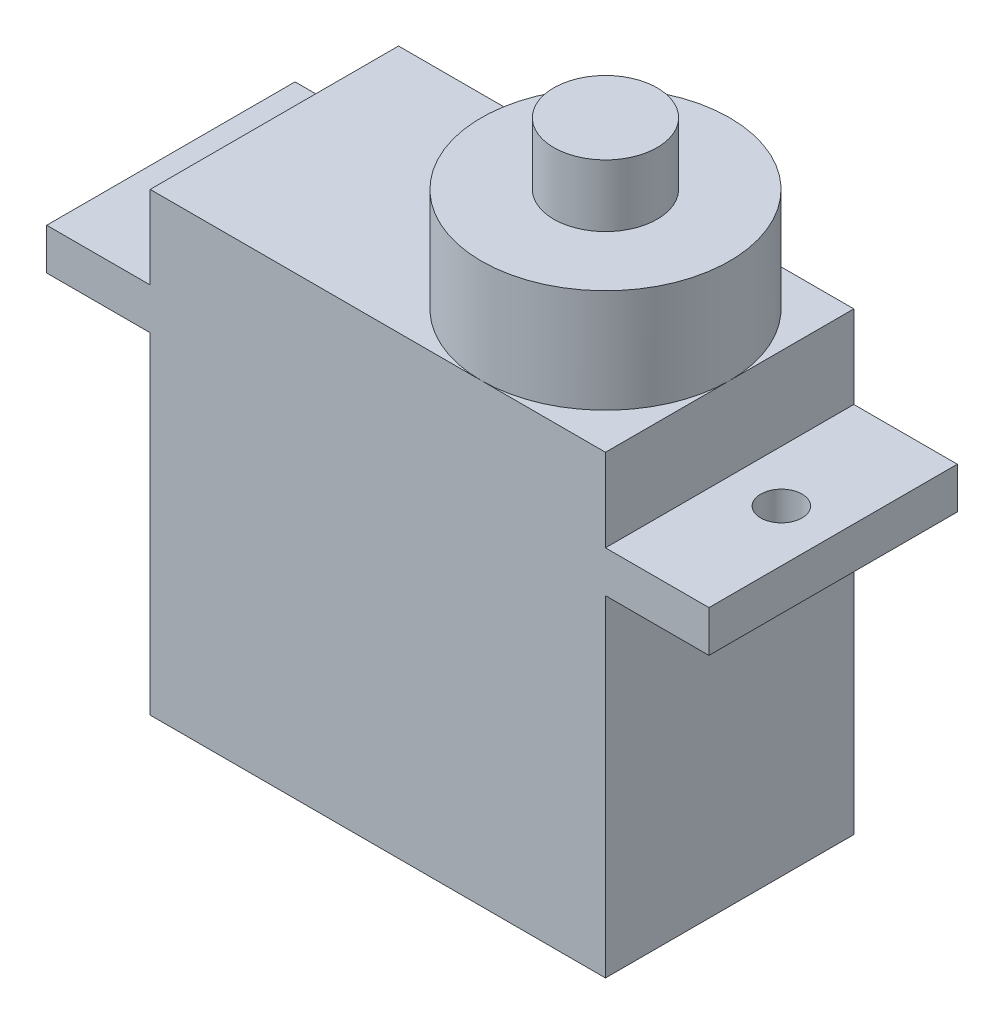
ISO-10303-21;
HEADER;
FILE_DESCRIPTION(('STEP AP214'),'2;1');
FILE_NAME('part.step','',(''),(''),'','','');
FILE_SCHEMA(('AUTOMOTIVE_DESIGN { 1 0 10303 214 1 1 1 1 }'));
ENDSEC;
DATA;
#1=APPLICATION_CONTEXT('core data for automotive mechanical design processes');
#2=APPLICATION_PROTOCOL_DEFINITION('international standard','automotive_design',2000,#1);
#3=PRODUCT_CONTEXT('',#1,'mechanical');
#4=PRODUCT('Part','Part','',(#3));
#5=PRODUCT_RELATED_PRODUCT_CATEGORY('part','',(#4));
#6=PRODUCT_DEFINITION_FORMATION('','',#4);
#7=PRODUCT_DEFINITION_CONTEXT('part definition',#1,'design');
#8=PRODUCT_DEFINITION('design','',#6,#7);
#9=PRODUCT_DEFINITION_SHAPE('','',#8);
#10=(LENGTH_UNIT() NAMED_UNIT(*) SI_UNIT(.MILLI.,.METRE.));
#11=(NAMED_UNIT(*) PLANE_ANGLE_UNIT() SI_UNIT($,.RADIAN.));
#12=(NAMED_UNIT(*) SI_UNIT($,.STERADIAN.) SOLID_ANGLE_UNIT());
#13=UNCERTAINTY_MEASURE_WITH_UNIT(LENGTH_MEASURE(1.E-05),#10,'distance_accuracy_value','');
#14=(GEOMETRIC_REPRESENTATION_CONTEXT(3) GLOBAL_UNCERTAINTY_ASSIGNED_CONTEXT((#13)) GLOBAL_UNIT_ASSIGNED_CONTEXT((#10,
#11,#12)) REPRESENTATION_CONTEXT('',''));
#15=CARTESIAN_POINT('',(0.,0.,0.));
#16=DIRECTION('',(0.,0.,1.));
#17=DIRECTION('',(1.,0.,0.));
#18=AXIS2_PLACEMENT_3D('',#15,#16,#17);
#19=CARTESIAN_POINT('',(16.,27.,-6.));
#20=DIRECTION('',(0.,1.,0.));
#21=DIRECTION('',(0.,0.,1.));
#22=AXIS2_PLACEMENT_3D('',#19,#20,#21);
#23=PLANE('',#22);
#24=CARTESIAN_POINT('',(16.,27.,-6.));
#25=DIRECTION('',(0.,1.,0.));
#26=DIRECTION('',(0.,0.,1.));
#27=AXIS2_PLACEMENT_3D('',#24,#25,#26);
#28=CIRCLE('',#27,6.);
#29=CARTESIAN_POINT('',(16.,27.,0.));
#30=VERTEX_POINT('',#29);
#31=EDGE_CURVE('E156',#30,#30,#28,.T.);
#32=ORIENTED_EDGE('',*,*,#31,.T.);
#33=EDGE_LOOP('',(#32));
#34=FACE_BOUND('',#33,.T.);
#35=CARTESIAN_POINT('',(16.,27.,-6.));
#36=DIRECTION('',(0.,1.,0.));
#37=DIRECTION('',(0.,0.,1.));
#38=AXIS2_PLACEMENT_3D('',#35,#36,#37);
#39=CIRCLE('',#38,2.5);
#40=CARTESIAN_POINT('',(16.,27.,-3.5));
#41=VERTEX_POINT('',#40);
#42=EDGE_CURVE('E457',#41,#41,#39,.T.);
#43=ORIENTED_EDGE('',*,*,#42,.F.);
#44=EDGE_LOOP('',(#43));
#45=FACE_BOUND('',#44,.T.);
#46=ADVANCED_FACE('F36',(#34,#45),#23,.T.);
#47=CARTESIAN_POINT('',(0.,22.,-12.));
#48=DIRECTION('',(0.,-1.,0.));
#49=DIRECTION('',(0.,0.,-1.));
#50=AXIS2_PLACEMENT_3D('',#47,#48,#49);
#51=PLANE('',#50);
#52=CARTESIAN_POINT('',(16.,22.,-6.));
#53=DIRECTION('',(0.,1.,0.));
#54=DIRECTION('',(0.,0.,1.));
#55=AXIS2_PLACEMENT_3D('',#52,#53,#54);
#56=CIRCLE('',#55,6.);
#57=CARTESIAN_POINT('',(16.,22.,0.));
#58=VERTEX_POINT('',#57);
#59=CARTESIAN_POINT('',(22.,22.,-6.));
#60=VERTEX_POINT('',#59);
#61=EDGE_CURVE('E47',#58,#60,#56,.T.);
#62=ORIENTED_EDGE('',*,*,#61,.F.);
#63=DIRECTION('',(1.,0.,0.));
#64=VECTOR('',#63,1.);
#65=CARTESIAN_POINT('',(0.,22.,0.));
#66=LINE('',#65,#64);
#67=CARTESIAN_POINT('',(22.,22.,0.));
#68=VERTEX_POINT('',#67);
#69=EDGE_CURVE('E142',#58,#68,#66,.T.);
#70=ORIENTED_EDGE('',*,*,#69,.T.);
#71=DIRECTION('',(0.,0.,-1.));
#72=VECTOR('',#71,1.);
#73=CARTESIAN_POINT('',(22.,22.,0.));
#74=LINE('',#73,#72);
#75=EDGE_CURVE('E154',#68,#60,#74,.T.);
#76=ORIENTED_EDGE('',*,*,#75,.T.);
#77=EDGE_LOOP('',(#62,#70,#76));
#78=FACE_BOUND('',#77,.T.);
#79=ADVANCED_FACE('F153',(#78),#51,.F.);
#80=CARTESIAN_POINT('',(16.,22.,-12.));
#81=VERTEX_POINT('',#80);
#82=EDGE_CURVE('E11',#60,#81,#56,.T.);
#83=ORIENTED_EDGE('',*,*,#82,.F.);
#84=CARTESIAN_POINT('',(22.,22.,-12.));
#85=VERTEX_POINT('',#84);
#86=EDGE_CURVE('E141',#60,#85,#74,.T.);
#87=ORIENTED_EDGE('',*,*,#86,.T.);
#88=DIRECTION('',(-1.,0.,0.));
#89=VECTOR('',#88,1.);
#90=CARTESIAN_POINT('',(0.,22.,-12.));
#91=LINE('',#90,#89);
#92=EDGE_CURVE('E224',#85,#81,#91,.T.);
#93=ORIENTED_EDGE('',*,*,#92,.T.);
#94=EDGE_LOOP('',(#83,#87,#93));
#95=FACE_BOUND('',#94,.T.);
#96=ADVANCED_FACE('F277',(#95),#51,.F.);
#97=EDGE_CURVE('E45',#81,#58,#56,.T.);
#98=ORIENTED_EDGE('',*,*,#97,.F.);
#99=CARTESIAN_POINT('',(0.,22.,-12.));
#100=VERTEX_POINT('',#99);
#101=EDGE_CURVE('E223',#81,#100,#91,.T.);
#102=ORIENTED_EDGE('',*,*,#101,.T.);
#103=DIRECTION('',(0.,0.,1.));
#104=VECTOR('',#103,1.);
#105=CARTESIAN_POINT('',(0.,22.,0.));
#106=LINE('',#105,#104);
#107=CARTESIAN_POINT('',(0.,22.,0.));
#108=VERTEX_POINT('',#107);
#109=EDGE_CURVE('E137',#100,#108,#106,.T.);
#110=ORIENTED_EDGE('',*,*,#109,.T.);
#111=EDGE_CURVE('E133',#108,#58,#66,.T.);
#112=ORIENTED_EDGE('',*,*,#111,.T.);
#113=EDGE_LOOP('',(#98,#102,#110,#112));
#114=FACE_BOUND('',#113,.T.);
#115=ADVANCED_FACE('F135',(#114),#51,.F.);
#116=CARTESIAN_POINT('',(0.,22.,0.));
#117=DIRECTION('',(1.,0.,0.));
#118=DIRECTION('',(0.,0.,-1.));
#119=AXIS2_PLACEMENT_3D('',#116,#117,#118);
#120=PLANE('',#119);
#121=DIRECTION('',(0.,-1.,0.));
#122=VECTOR('',#121,1.);
#123=CARTESIAN_POINT('',(0.,22.,-12.));
#124=LINE('',#123,#122);
#125=CARTESIAN_POINT('',(0.,18.,-12.));
#126=VERTEX_POINT('',#125);
#127=EDGE_CURVE('E237',#100,#126,#124,.T.);
#128=ORIENTED_EDGE('',*,*,#127,.T.);
#129=DIRECTION('',(0.,0.,1.));
#130=VECTOR('',#129,1.);
#131=CARTESIAN_POINT('',(0.,18.,0.));
#132=LINE('',#131,#130);
#133=CARTESIAN_POINT('',(0.,18.,0.));
#134=VERTEX_POINT('',#133);
#135=EDGE_CURVE('E216',#126,#134,#132,.T.);
#136=ORIENTED_EDGE('',*,*,#135,.T.);
#137=DIRECTION('',(0.,-1.,0.));
#138=VECTOR('',#137,1.);
#139=CARTESIAN_POINT('',(0.,22.,0.));
#140=LINE('',#139,#138);
#141=EDGE_CURVE('E159',#108,#134,#140,.T.);
#142=ORIENTED_EDGE('',*,*,#141,.F.);
#143=ORIENTED_EDGE('',*,*,#109,.F.);
#144=EDGE_LOOP('',(#128,#136,#142,#143));
#145=FACE_BOUND('',#144,.T.);
#146=ADVANCED_FACE('F284',(#145),#120,.F.);
#147=CARTESIAN_POINT('',(22.,22.,0.));
#148=DIRECTION('',(-1.,0.,0.));
#149=DIRECTION('',(0.,0.,1.));
#150=AXIS2_PLACEMENT_3D('',#147,#148,#149);
#151=PLANE('',#150);
#152=DIRECTION('',(0.,-1.,0.));
#153=VECTOR('',#152,1.);
#154=CARTESIAN_POINT('',(22.,22.,0.));
#155=LINE('',#154,#153);
#156=CARTESIAN_POINT('',(22.,18.,0.));
#157=VERTEX_POINT('',#156);
#158=EDGE_CURVE('E148',#68,#157,#155,.T.);
#159=ORIENTED_EDGE('',*,*,#158,.T.);
#160=DIRECTION('',(0.,0.,-1.));
#161=VECTOR('',#160,1.);
#162=CARTESIAN_POINT('',(22.,18.,0.));
#163=LINE('',#162,#161);
#164=CARTESIAN_POINT('',(22.,18.,-12.));
#165=VERTEX_POINT('',#164);
#166=EDGE_CURVE('E214',#157,#165,#163,.T.);
#167=ORIENTED_EDGE('',*,*,#166,.T.);
#168=DIRECTION('',(0.,-1.,0.));
#169=VECTOR('',#168,1.);
#170=CARTESIAN_POINT('',(22.,22.,-12.));
#171=LINE('',#170,#169);
#172=EDGE_CURVE('E241',#85,#165,#171,.T.);
#173=ORIENTED_EDGE('',*,*,#172,.F.);
#174=ORIENTED_EDGE('',*,*,#86,.F.);
#175=ORIENTED_EDGE('',*,*,#75,.F.);
#176=EDGE_LOOP('',(#159,#167,#173,#174,#175));
#177=FACE_BOUND('',#176,.T.);
#178=ADVANCED_FACE('F274',(#177),#151,.F.);
#179=CARTESIAN_POINT('',(0.,16.,0.));
#180=VERTEX_POINT('',#179);
#181=CARTESIAN_POINT('',(0.,0.,0.));
#182=VERTEX_POINT('',#181);
#183=EDGE_CURVE('E160',#180,#182,#140,.T.);
#184=ORIENTED_EDGE('',*,*,#183,.F.);
#185=DIRECTION('',(0.,0.,-1.));
#186=VECTOR('',#185,1.);
#187=CARTESIAN_POINT('',(0.,16.,0.));
#188=LINE('',#187,#186);
#189=CARTESIAN_POINT('',(0.,16.,-12.));
#190=VERTEX_POINT('',#189);
#191=EDGE_CURVE('E211',#180,#190,#188,.T.);
#192=ORIENTED_EDGE('',*,*,#191,.T.);
#193=CARTESIAN_POINT('',(0.,0.,-12.));
#194=VERTEX_POINT('',#193);
#195=EDGE_CURVE('E226',#190,#194,#124,.T.);
#196=ORIENTED_EDGE('',*,*,#195,.T.);
#197=DIRECTION('',(0.,0.,1.));
#198=VECTOR('',#197,1.);
#199=CARTESIAN_POINT('',(0.,0.,0.));
#200=LINE('',#199,#198);
#201=EDGE_CURVE('E219',#194,#182,#200,.T.);
#202=ORIENTED_EDGE('',*,*,#201,.T.);
#203=EDGE_LOOP('',(#184,#192,#196,#202));
#204=FACE_BOUND('',#203,.T.);
#205=ADVANCED_FACE('F38',(#204),#120,.F.);
#206=CARTESIAN_POINT('',(0.,22.,0.));
#207=DIRECTION('',(0.,0.,-1.));
#208=DIRECTION('',(-1.,0.,0.));
#209=AXIS2_PLACEMENT_3D('',#206,#207,#208);
#210=PLANE('',#209);
#211=CARTESIAN_POINT('',(22.,16.,0.));
#212=VERTEX_POINT('',#211);
#213=CARTESIAN_POINT('',(22.,0.,0.));
#214=VERTEX_POINT('',#213);
#215=EDGE_CURVE('E244',#212,#214,#155,.T.);
#216=ORIENTED_EDGE('',*,*,#215,.F.);
#217=DIRECTION('',(1.,0.,0.));
#218=VECTOR('',#217,1.);
#219=CARTESIAN_POINT('',(-5.,16.,0.));
#220=LINE('',#219,#218);
#221=CARTESIAN_POINT('',(27.,16.,0.));
#222=VERTEX_POINT('',#221);
#223=EDGE_CURVE('E191',#212,#222,#220,.T.);
#224=ORIENTED_EDGE('',*,*,#223,.T.);
#225=DIRECTION('',(0.,1.,0.));
#226=VECTOR('',#225,1.);
#227=CARTESIAN_POINT('',(27.,18.,0.));
#228=LINE('',#227,#226);
#229=CARTESIAN_POINT('',(27.,18.,0.));
#230=VERTEX_POINT('',#229);
#231=EDGE_CURVE('E194',#222,#230,#228,.T.);
#232=ORIENTED_EDGE('',*,*,#231,.T.);
#233=DIRECTION('',(-1.,0.,0.));
#234=VECTOR('',#233,1.);
#235=CARTESIAN_POINT('',(-5.,18.,0.));
#236=LINE('',#235,#234);
#237=EDGE_CURVE('E177',#230,#157,#236,.T.);
#238=ORIENTED_EDGE('',*,*,#237,.T.);
#239=ORIENTED_EDGE('',*,*,#158,.F.);
#240=ORIENTED_EDGE('',*,*,#69,.F.);
#241=ORIENTED_EDGE('',*,*,#111,.F.);
#242=ORIENTED_EDGE('',*,*,#141,.T.);
#243=CARTESIAN_POINT('',(-5.,18.,0.));
#244=VERTEX_POINT('',#243);
#245=EDGE_CURVE('E197',#134,#244,#236,.T.);
#246=ORIENTED_EDGE('',*,*,#245,.T.);
#247=DIRECTION('',(0.,-1.,0.));
#248=VECTOR('',#247,1.);
#249=CARTESIAN_POINT('',(-5.,18.,0.));
#250=LINE('',#249,#248);
#251=CARTESIAN_POINT('',(-5.,16.,0.));
#252=VERTEX_POINT('',#251);
#253=EDGE_CURVE('E188',#244,#252,#250,.T.);
#254=ORIENTED_EDGE('',*,*,#253,.T.);
#255=EDGE_CURVE('E192',#252,#180,#220,.T.);
#256=ORIENTED_EDGE('',*,*,#255,.T.);
#257=ORIENTED_EDGE('',*,*,#183,.T.);
#258=DIRECTION('',(1.,0.,0.));
#259=VECTOR('',#258,1.);
#260=CARTESIAN_POINT('',(0.,0.,0.));
#261=LINE('',#260,#259);
#262=EDGE_CURVE('E229',#182,#214,#261,.T.);
#263=ORIENTED_EDGE('',*,*,#262,.T.);
#264=EDGE_LOOP('',(#216,#224,#232,#238,#239,#240,#241,#242,#246,#254,#256,#257,#263));
#265=FACE_BOUND('',#264,.T.);
#266=ADVANCED_FACE('F146',(#265),#210,.F.);
#267=CARTESIAN_POINT('',(22.,16.,-12.));
#268=VERTEX_POINT('',#267);
#269=CARTESIAN_POINT('',(22.,0.,-12.));
#270=VERTEX_POINT('',#269);
#271=EDGE_CURVE('E240',#268,#270,#171,.T.);
#272=ORIENTED_EDGE('',*,*,#271,.F.);
#273=DIRECTION('',(0.,0.,1.));
#274=VECTOR('',#273,1.);
#275=CARTESIAN_POINT('',(22.,16.,0.));
#276=LINE('',#275,#274);
#277=EDGE_CURVE('E202',#268,#212,#276,.T.);
#278=ORIENTED_EDGE('',*,*,#277,.T.);
#279=ORIENTED_EDGE('',*,*,#215,.T.);
#280=DIRECTION('',(0.,0.,-1.));
#281=VECTOR('',#280,1.);
#282=CARTESIAN_POINT('',(22.,0.,0.));
#283=LINE('',#282,#281);
#284=EDGE_CURVE('E232',#214,#270,#283,.T.);
#285=ORIENTED_EDGE('',*,*,#284,.T.);
#286=EDGE_LOOP('',(#272,#278,#279,#285));
#287=FACE_BOUND('',#286,.T.);
#288=ADVANCED_FACE('F248',(#287),#151,.F.);
#289=CARTESIAN_POINT('',(0.,22.,-12.));
#290=DIRECTION('',(0.,0.,1.));
#291=DIRECTION('',(1.,0.,0.));
#292=AXIS2_PLACEMENT_3D('',#289,#290,#291);
#293=PLANE('',#292);
#294=ORIENTED_EDGE('',*,*,#195,.F.);
#295=DIRECTION('',(1.,0.,0.));
#296=VECTOR('',#295,1.);
#297=CARTESIAN_POINT('',(-5.,16.,-12.));
#298=LINE('',#297,#296);
#299=CARTESIAN_POINT('',(-5.,16.,-12.));
#300=VERTEX_POINT('',#299);
#301=EDGE_CURVE('E178',#300,#190,#298,.T.);
#302=ORIENTED_EDGE('',*,*,#301,.F.);
#303=DIRECTION('',(0.,-1.,0.));
#304=VECTOR('',#303,1.);
#305=CARTESIAN_POINT('',(-5.,18.,-12.));
#306=LINE('',#305,#304);
#307=CARTESIAN_POINT('',(-5.,18.,-12.));
#308=VERTEX_POINT('',#307);
#309=EDGE_CURVE('E173',#308,#300,#306,.T.);
#310=ORIENTED_EDGE('',*,*,#309,.F.);
#311=DIRECTION('',(-1.,0.,0.));
#312=VECTOR('',#311,1.);
#313=CARTESIAN_POINT('',(-5.,18.,-12.));
#314=LINE('',#313,#312);
#315=EDGE_CURVE('E183',#126,#308,#314,.T.);
#316=ORIENTED_EDGE('',*,*,#315,.F.);
#317=ORIENTED_EDGE('',*,*,#127,.F.);
#318=ORIENTED_EDGE('',*,*,#101,.F.);
#319=ORIENTED_EDGE('',*,*,#92,.F.);
#320=ORIENTED_EDGE('',*,*,#172,.T.);
#321=CARTESIAN_POINT('',(27.,18.,-12.));
#322=VERTEX_POINT('',#321);
#323=EDGE_CURVE('E184',#322,#165,#314,.T.);
#324=ORIENTED_EDGE('',*,*,#323,.F.);
#325=DIRECTION('',(0.,1.,0.));
#326=VECTOR('',#325,1.);
#327=CARTESIAN_POINT('',(27.,18.,-12.));
#328=LINE('',#327,#326);
#329=CARTESIAN_POINT('',(27.,16.,-12.));
#330=VERTEX_POINT('',#329);
#331=EDGE_CURVE('E180',#330,#322,#328,.T.);
#332=ORIENTED_EDGE('',*,*,#331,.F.);
#333=EDGE_CURVE('E176',#268,#330,#298,.T.);
#334=ORIENTED_EDGE('',*,*,#333,.F.);
#335=ORIENTED_EDGE('',*,*,#271,.T.);
#336=DIRECTION('',(-1.,0.,0.));
#337=VECTOR('',#336,1.);
#338=CARTESIAN_POINT('',(0.,0.,-12.));
#339=LINE('',#338,#337);
#340=EDGE_CURVE('E220',#270,#194,#339,.T.);
#341=ORIENTED_EDGE('',*,*,#340,.T.);
#342=EDGE_LOOP('',(#294,#302,#310,#316,#317,#318,#319,#320,#324,#332,#334,#335,#341));
#343=FACE_BOUND('',#342,.T.);
#344=ADVANCED_FACE('F260',(#343),#293,.F.);
#345=CARTESIAN_POINT('',(0.,0.,-12.));
#346=DIRECTION('',(0.,-1.,0.));
#347=DIRECTION('',(0.,0.,-1.));
#348=AXIS2_PLACEMENT_3D('',#345,#346,#347);
#349=PLANE('',#348);
#350=ORIENTED_EDGE('',*,*,#201,.F.);
#351=ORIENTED_EDGE('',*,*,#340,.F.);
#352=ORIENTED_EDGE('',*,*,#284,.F.);
#353=ORIENTED_EDGE('',*,*,#262,.F.);
#354=EDGE_LOOP('',(#350,#351,#352,#353));
#355=FACE_BOUND('',#354,.T.);
#356=ADVANCED_FACE('F257',(#355),#349,.T.);
#357=CARTESIAN_POINT('',(27.,18.,-12.));
#358=DIRECTION('',(1.,0.,0.));
#359=DIRECTION('',(0.,1.,0.));
#360=AXIS2_PLACEMENT_3D('',#357,#358,#359);
#361=PLANE('',#360);
#362=ORIENTED_EDGE('',*,*,#231,.F.);
#363=DIRECTION('',(0.,0.,1.));
#364=VECTOR('',#363,1.);
#365=CARTESIAN_POINT('',(27.,16.,-12.));
#366=LINE('',#365,#364);
#367=EDGE_CURVE('E205',#330,#222,#366,.T.);
#368=ORIENTED_EDGE('',*,*,#367,.F.);
#369=ORIENTED_EDGE('',*,*,#331,.T.);
#370=DIRECTION('',(0.,0.,1.));
#371=VECTOR('',#370,1.);
#372=CARTESIAN_POINT('',(27.,18.,-12.));
#373=LINE('',#372,#371);
#374=EDGE_CURVE('E203',#322,#230,#373,.T.);
#375=ORIENTED_EDGE('',*,*,#374,.T.);
#376=EDGE_LOOP('',(#362,#368,#369,#375));
#377=FACE_BOUND('',#376,.T.);
#378=ADVANCED_FACE('F315',(#377),#361,.T.);
#379=CARTESIAN_POINT('',(-5.,16.,-12.));
#380=DIRECTION('',(0.,-1.,0.));
#381=DIRECTION('',(1.,0.,0.));
#382=AXIS2_PLACEMENT_3D('',#379,#380,#381);
#383=PLANE('',#382);
#384=CARTESIAN_POINT('',(24.5,16.,-6.));
#385=DIRECTION('',(0.,-1.,0.));
#386=DIRECTION('',(1.,0.,0.));
#387=AXIS2_PLACEMENT_3D('',#384,#385,#386);
#388=CIRCLE('',#387,1.);
#389=CARTESIAN_POINT('',(25.5,16.,-6.));
#390=VERTEX_POINT('',#389);
#391=EDGE_CURVE('E167',#390,#390,#388,.T.);
#392=ORIENTED_EDGE('',*,*,#391,.F.);
#393=EDGE_LOOP('',(#392));
#394=FACE_BOUND('',#393,.T.);
#395=ORIENTED_EDGE('',*,*,#277,.F.);
#396=ORIENTED_EDGE('',*,*,#333,.T.);
#397=ORIENTED_EDGE('',*,*,#367,.T.);
#398=ORIENTED_EDGE('',*,*,#223,.F.);
#399=EDGE_LOOP('',(#395,#396,#397,#398));
#400=FACE_BOUND('',#399,.T.);
#401=ADVANCED_FACE('F265',(#394,#400),#383,.T.);
#402=CARTESIAN_POINT('',(-5.,18.,-12.));
#403=DIRECTION('',(0.,1.,0.));
#404=DIRECTION('',(0.,0.,1.));
#405=AXIS2_PLACEMENT_3D('',#402,#403,#404);
#406=PLANE('',#405);
#407=CARTESIAN_POINT('',(24.5,18.,-6.));
#408=DIRECTION('',(0.,1.,0.));
#409=DIRECTION('',(0.,0.,1.));
#410=AXIS2_PLACEMENT_3D('',#407,#408,#409);
#411=CIRCLE('',#410,1.);
#412=CARTESIAN_POINT('',(24.5,18.,-5.));
#413=VERTEX_POINT('',#412);
#414=EDGE_CURVE('E164',#413,#413,#411,.T.);
#415=ORIENTED_EDGE('',*,*,#414,.F.);
#416=EDGE_LOOP('',(#415));
#417=FACE_BOUND('',#416,.T.);
#418=ORIENTED_EDGE('',*,*,#166,.F.);
#419=ORIENTED_EDGE('',*,*,#237,.F.);
#420=ORIENTED_EDGE('',*,*,#374,.F.);
#421=ORIENTED_EDGE('',*,*,#323,.T.);
#422=EDGE_LOOP('',(#418,#419,#420,#421));
#423=FACE_BOUND('',#422,.T.);
#424=ADVANCED_FACE('F271',(#417,#423),#406,.T.);
#425=CARTESIAN_POINT('',(-2.5,18.,-6.));
#426=DIRECTION('',(0.,1.,0.));
#427=DIRECTION('',(0.,0.,1.));
#428=AXIS2_PLACEMENT_3D('',#425,#426,#427);
#429=CIRCLE('',#428,1.);
#430=CARTESIAN_POINT('',(-2.5,18.,-5.));
#431=VERTEX_POINT('',#430);
#432=EDGE_CURVE('E170',#431,#431,#429,.T.);
#433=ORIENTED_EDGE('',*,*,#432,.F.);
#434=EDGE_LOOP('',(#433));
#435=FACE_BOUND('',#434,.T.);
#436=ORIENTED_EDGE('',*,*,#135,.F.);
#437=ORIENTED_EDGE('',*,*,#315,.T.);
#438=DIRECTION('',(0.,0.,1.));
#439=VECTOR('',#438,1.);
#440=CARTESIAN_POINT('',(-5.,18.,-12.));
#441=LINE('',#440,#439);
#442=EDGE_CURVE('E199',#308,#244,#441,.T.);
#443=ORIENTED_EDGE('',*,*,#442,.T.);
#444=ORIENTED_EDGE('',*,*,#245,.F.);
#445=EDGE_LOOP('',(#436,#437,#443,#444));
#446=FACE_BOUND('',#445,.T.);
#447=ADVANCED_FACE('F310',(#435,#446),#406,.T.);
#448=CARTESIAN_POINT('',(-2.5,16.,-6.));
#449=DIRECTION('',(0.,-1.,0.));
#450=DIRECTION('',(1.,0.,0.));
#451=AXIS2_PLACEMENT_3D('',#448,#449,#450);
#452=CIRCLE('',#451,1.);
#453=CARTESIAN_POINT('',(-1.5,16.,-6.));
#454=VERTEX_POINT('',#453);
#455=EDGE_CURVE('E40',#454,#454,#452,.T.);
#456=ORIENTED_EDGE('',*,*,#455,.F.);
#457=EDGE_LOOP('',(#456));
#458=FACE_BOUND('',#457,.T.);
#459=ORIENTED_EDGE('',*,*,#191,.F.);
#460=ORIENTED_EDGE('',*,*,#255,.F.);
#461=DIRECTION('',(0.,0.,1.));
#462=VECTOR('',#461,1.);
#463=CARTESIAN_POINT('',(-5.,16.,-12.));
#464=LINE('',#463,#462);
#465=EDGE_CURVE('E187',#300,#252,#464,.T.);
#466=ORIENTED_EDGE('',*,*,#465,.F.);
#467=ORIENTED_EDGE('',*,*,#301,.T.);
#468=EDGE_LOOP('',(#459,#460,#466,#467));
#469=FACE_BOUND('',#468,.T.);
#470=ADVANCED_FACE('F313',(#458,#469),#383,.T.);
#471=CARTESIAN_POINT('',(-5.,18.,-12.));
#472=DIRECTION('',(-1.,0.,0.));
#473=DIRECTION('',(0.,0.,1.));
#474=AXIS2_PLACEMENT_3D('',#471,#472,#473);
#475=PLANE('',#474);
#476=ORIENTED_EDGE('',*,*,#253,.F.);
#477=ORIENTED_EDGE('',*,*,#442,.F.);
#478=ORIENTED_EDGE('',*,*,#309,.T.);
#479=ORIENTED_EDGE('',*,*,#465,.T.);
#480=EDGE_LOOP('',(#476,#477,#478,#479));
#481=FACE_BOUND('',#480,.T.);
#482=ADVANCED_FACE('F308',(#481),#475,.T.);
#483=CARTESIAN_POINT('',(-2.5,-4.,-6.));
#484=DIRECTION('',(0.,1.,0.));
#485=DIRECTION('',(0.,0.,1.));
#486=AXIS2_PLACEMENT_3D('',#483,#484,#485);
#487=CYLINDRICAL_SURFACE('',#486,1.);
#488=ORIENTED_EDGE('',*,*,#455,.T.);
#489=EDGE_LOOP('',(#488));
#490=FACE_BOUND('',#489,.T.);
#491=ORIENTED_EDGE('',*,*,#432,.T.);
#492=EDGE_LOOP('',(#491));
#493=FACE_BOUND('',#492,.T.);
#494=ADVANCED_FACE('F304',(#490,#493),#487,.F.);
#495=CARTESIAN_POINT('',(24.5,-4.,-6.));
#496=DIRECTION('',(0.,1.,0.));
#497=DIRECTION('',(0.,0.,1.));
#498=AXIS2_PLACEMENT_3D('',#495,#496,#497);
#499=CYLINDRICAL_SURFACE('',#498,1.);
#500=ORIENTED_EDGE('',*,*,#391,.T.);
#501=EDGE_LOOP('',(#500));
#502=FACE_BOUND('',#501,.T.);
#503=ORIENTED_EDGE('',*,*,#414,.T.);
#504=EDGE_LOOP('',(#503));
#505=FACE_BOUND('',#504,.T.);
#506=ADVANCED_FACE('F300',(#502,#505),#499,.F.);
#507=CARTESIAN_POINT('',(16.,27.,-6.));
#508=DIRECTION('',(0.,-1.,0.));
#509=DIRECTION('',(0.,0.,-1.));
#510=AXIS2_PLACEMENT_3D('',#507,#508,#509);
#511=CYLINDRICAL_SURFACE('',#510,6.);
#512=ORIENTED_EDGE('',*,*,#31,.F.);
#513=EDGE_LOOP('',(#512));
#514=FACE_BOUND('',#513,.T.);
#515=ORIENTED_EDGE('',*,*,#61,.T.);
#516=ORIENTED_EDGE('',*,*,#82,.T.);
#517=ORIENTED_EDGE('',*,*,#97,.T.);
#518=EDGE_LOOP('',(#515,#516,#517));
#519=FACE_BOUND('',#518,.T.);
#520=ADVANCED_FACE('F158',(#514,#519),#511,.T.);
#521=CARTESIAN_POINT('',(16.,30.,-6.));
#522=DIRECTION('',(0.,-1.,0.));
#523=DIRECTION('',(0.,0.,-1.));
#524=AXIS2_PLACEMENT_3D('',#521,#522,#523);
#525=CYLINDRICAL_SURFACE('',#524,2.5);
#526=CARTESIAN_POINT('',(16.,30.,-6.));
#527=DIRECTION('',(0.,1.,0.));
#528=DIRECTION('',(0.,0.,1.));
#529=AXIS2_PLACEMENT_3D('',#526,#527,#528);
#530=CIRCLE('',#529,2.5);
#531=CARTESIAN_POINT('',(16.,30.,-3.5));
#532=VERTEX_POINT('',#531);
#533=EDGE_CURVE('E157',#532,#532,#530,.T.);
#534=ORIENTED_EDGE('',*,*,#533,.F.);
#535=EDGE_LOOP('',(#534));
#536=FACE_BOUND('',#535,.T.);
#537=ORIENTED_EDGE('',*,*,#42,.T.);
#538=EDGE_LOOP('',(#537));
#539=FACE_BOUND('',#538,.T.);
#540=ADVANCED_FACE('F296',(#536,#539),#525,.T.);
#541=CARTESIAN_POINT('',(16.,30.,-6.));
#542=DIRECTION('',(0.,1.,0.));
#543=DIRECTION('',(0.,0.,1.));
#544=AXIS2_PLACEMENT_3D('',#541,#542,#543);
#545=PLANE('',#544);
#546=ORIENTED_EDGE('',*,*,#533,.T.);
#547=EDGE_LOOP('',(#546));
#548=FACE_BOUND('',#547,.T.);
#549=ADVANCED_FACE('F443',(#548),#545,.T.);
#550=CLOSED_SHELL('',(#46,#79,#96,#115,#146,#178,#205,#266,#288,#344,#356,#378,#401,#424,#447,
#470,#482,#494,#506,#520,#540,#549));
#551=MANIFOLD_SOLID_BREP('B2',#550);
#552=ADVANCED_BREP_SHAPE_REPRESENTATION('',(#18,#551),#14);
#553=SHAPE_DEFINITION_REPRESENTATION(#9,#552);
ENDSEC;
END-ISO-10303-21;
